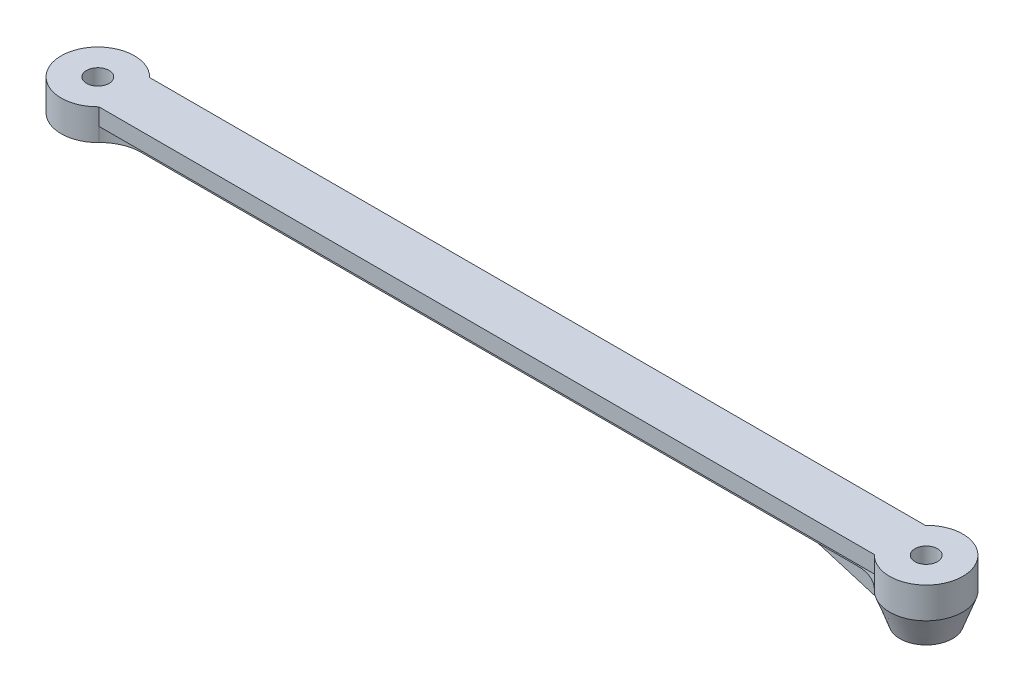
ISO-10303-21;
HEADER;
FILE_DESCRIPTION(('STEP AP214'),'2;1');
FILE_NAME('part.step','',(''),(''),'','','');
FILE_SCHEMA(('AUTOMOTIVE_DESIGN { 1 0 10303 214 1 1 1 1 }'));
ENDSEC;
DATA;
#1=APPLICATION_CONTEXT('core data for automotive mechanical design processes');
#2=APPLICATION_PROTOCOL_DEFINITION('international standard','automotive_design',2000,#1);
#3=PRODUCT_CONTEXT('',#1,'mechanical');
#4=PRODUCT('Part','Part','',(#3));
#5=PRODUCT_RELATED_PRODUCT_CATEGORY('part','',(#4));
#6=PRODUCT_DEFINITION_FORMATION('','',#4);
#7=PRODUCT_DEFINITION_CONTEXT('part definition',#1,'design');
#8=PRODUCT_DEFINITION('design','',#6,#7);
#9=PRODUCT_DEFINITION_SHAPE('','',#8);
#10=(LENGTH_UNIT() NAMED_UNIT(*) SI_UNIT(.MILLI.,.METRE.));
#11=(NAMED_UNIT(*) PLANE_ANGLE_UNIT() SI_UNIT($,.RADIAN.));
#12=(NAMED_UNIT(*) SI_UNIT($,.STERADIAN.) SOLID_ANGLE_UNIT());
#13=UNCERTAINTY_MEASURE_WITH_UNIT(LENGTH_MEASURE(1.E-05),#10,'distance_accuracy_value','');
#14=(GEOMETRIC_REPRESENTATION_CONTEXT(3) GLOBAL_UNCERTAINTY_ASSIGNED_CONTEXT((#13)) GLOBAL_UNIT_ASSIGNED_CONTEXT((#10,
#11,#12)) REPRESENTATION_CONTEXT('',''));
#15=CARTESIAN_POINT('',(0.,0.,0.));
#16=DIRECTION('',(0.,0.,1.));
#17=DIRECTION('',(1.,0.,0.));
#18=AXIS2_PLACEMENT_3D('',#15,#16,#17);
#19=CARTESIAN_POINT('',(-147.,0.,0.));
#20=DIRECTION('',(0.,1.,0.));
#21=DIRECTION('',(0.,0.,1.));
#22=AXIS2_PLACEMENT_3D('',#19,#20,#21);
#23=PLANE('',#22);
#24=CARTESIAN_POINT('',(-147.,0.,0.));
#25=DIRECTION('',(0.,1.,0.));
#26=DIRECTION('',(0.,0.,1.));
#27=AXIS2_PLACEMENT_3D('',#24,#25,#26);
#28=CIRCLE('',#27,2.);
#29=CARTESIAN_POINT('',(-147.,0.,2.));
#30=VERTEX_POINT('',#29);
#31=EDGE_CURVE('E262',#30,#30,#28,.T.);
#32=ORIENTED_EDGE('',*,*,#31,.T.);
#33=EDGE_LOOP('',(#32));
#34=FACE_BOUND('',#33,.T.);
#35=DIRECTION('',(-1.,0.,0.));
#36=VECTOR('',#35,1.);
#37=CARTESIAN_POINT('',(-3.08000003216462,0.,1.25));
#38=LINE('',#37,#36);
#39=CARTESIAN_POINT('',(-6.37929922012127,0.,1.25000003393926));
#40=VERTEX_POINT('',#39);
#41=CARTESIAN_POINT('',(-21.2800000321646,0.,1.25));
#42=VERTEX_POINT('',#41);
#43=EDGE_CURVE('E153',#40,#42,#38,.T.);
#44=ORIENTED_EDGE('',*,*,#43,.F.);
#45=CARTESIAN_POINT('',(0.,0.,0.));
#46=DIRECTION('',(0.,-1.,0.));
#47=DIRECTION('',(0.,0.,-1.));
#48=AXIS2_PLACEMENT_3D('',#45,#46,#47);
#49=CIRCLE('',#48,6.50000000000002);
#50=CARTESIAN_POINT('',(-4.69109029053925,0.,4.4992945804657));
#51=VERTEX_POINT('',#50);
#52=EDGE_CURVE('E231',#51,#40,#49,.T.);
#53=ORIENTED_EDGE('',*,*,#52,.F.);
#54=CARTESIAN_POINT('',(-9.96713348962479,0.,9.56249999999999));
#55=DIRECTION('',(0.,-1.,0.));
#56=DIRECTION('',(0.,0.,1.));
#57=AXIS2_PLACEMENT_3D('',#54,#55,#56);
#58=CIRCLE('',#57,7.3125);
#59=CARTESIAN_POINT('',(-9.9671334896248,0.,2.24999999999998));
#60=VERTEX_POINT('',#59);
#61=EDGE_CURVE('E257',#60,#51,#58,.T.);
#62=ORIENTED_EDGE('',*,*,#61,.F.);
#63=DIRECTION('',(1.,0.,0.));
#64=VECTOR('',#63,1.);
#65=CARTESIAN_POINT('',(-9.9671334896248,0.,2.24999999999998));
#66=LINE('',#65,#64);
#67=CARTESIAN_POINT('',(-137.032866510375,0.,2.24999999999999));
#68=VERTEX_POINT('',#67);
#69=EDGE_CURVE('E244',#68,#60,#66,.T.);
#70=ORIENTED_EDGE('',*,*,#69,.F.);
#71=CARTESIAN_POINT('',(-137.032866510375,0.,9.56250000000001));
#72=DIRECTION('',(0.,-1.,0.));
#73=DIRECTION('',(0.,0.,-1.));
#74=AXIS2_PLACEMENT_3D('',#71,#72,#73);
#75=CIRCLE('',#74,7.31250000000002);
#76=CARTESIAN_POINT('',(-142.309584240177,0.,4.49999999999997));
#77=VERTEX_POINT('',#76);
#78=EDGE_CURVE('E254',#77,#68,#75,.T.);
#79=ORIENTED_EDGE('',*,*,#78,.F.);
#80=CARTESIAN_POINT('',(-147.,0.,0.));
#81=DIRECTION('',(0.,1.,0.));
#82=DIRECTION('',(0.,0.,1.));
#83=AXIS2_PLACEMENT_3D('',#80,#81,#82);
#84=CIRCLE('',#83,6.5);
#85=CARTESIAN_POINT('',(-142.309584240177,0.,-4.5));
#86=VERTEX_POINT('',#85);
#87=EDGE_CURVE('E300',#86,#77,#84,.T.);
#88=ORIENTED_EDGE('',*,*,#87,.F.);
#89=CARTESIAN_POINT('',(-137.032866510375,0.,-9.56250000000001));
#90=DIRECTION('',(0.,-1.,0.));
#91=DIRECTION('',(0.,0.,1.));
#92=AXIS2_PLACEMENT_3D('',#89,#90,#91);
#93=CIRCLE('',#92,7.31249999999999);
#94=CARTESIAN_POINT('',(-137.032866510375,0.,-2.25000000000001));
#95=VERTEX_POINT('',#94);
#96=EDGE_CURVE('E271',#95,#86,#93,.T.);
#97=ORIENTED_EDGE('',*,*,#96,.F.);
#98=DIRECTION('',(-1.,0.,0.));
#99=VECTOR('',#98,1.);
#100=CARTESIAN_POINT('',(-9.96713348962481,0.,-2.25));
#101=LINE('',#100,#99);
#102=CARTESIAN_POINT('',(-9.96713348962481,0.,-2.25));
#103=VERTEX_POINT('',#102);
#104=EDGE_CURVE('E280',#103,#95,#101,.T.);
#105=ORIENTED_EDGE('',*,*,#104,.F.);
#106=CARTESIAN_POINT('',(-9.96713348962481,0.,-9.56250000000001));
#107=DIRECTION('',(0.,-1.,0.));
#108=DIRECTION('',(0.,0.,-1.));
#109=AXIS2_PLACEMENT_3D('',#106,#107,#108);
#110=CIRCLE('',#109,7.3125);
#111=CARTESIAN_POINT('',(-4.69043967413093,0.,-4.50002301416721));
#112=VERTEX_POINT('',#111);
#113=EDGE_CURVE('E283',#112,#103,#110,.T.);
#114=ORIENTED_EDGE('',*,*,#113,.F.);
#115=CARTESIAN_POINT('',(-6.37929766491856,0.,-1.24999989519081));
#116=VERTEX_POINT('',#115);
#117=EDGE_CURVE('E441',#116,#112,#49,.T.);
#118=ORIENTED_EDGE('',*,*,#117,.F.);
#119=DIRECTION('',(-1.,0.,0.));
#120=VECTOR('',#119,1.);
#121=CARTESIAN_POINT('',(-3.08000003216462,0.,-1.25));
#122=LINE('',#121,#120);
#123=CARTESIAN_POINT('',(-21.2800000321646,0.,-1.25));
#124=VERTEX_POINT('',#123);
#125=EDGE_CURVE('E60',#116,#124,#122,.T.);
#126=ORIENTED_EDGE('',*,*,#125,.T.);
#127=DIRECTION('',(0.,0.,-1.));
#128=VECTOR('',#127,1.);
#129=CARTESIAN_POINT('',(-21.2800000321646,0.,1.25));
#130=LINE('',#129,#128);
#131=EDGE_CURVE('E55',#42,#124,#130,.T.);
#132=ORIENTED_EDGE('',*,*,#131,.F.);
#133=EDGE_LOOP('',(#44,#53,#62,#70,#79,#88,#97,#105,#114,#118,#126,#132));
#134=FACE_BOUND('',#133,.T.);
#135=ADVANCED_FACE('F37',(#34,#134),#23,.F.);
#136=CARTESIAN_POINT('',(0.,-5.,0.));
#137=DIRECTION('',(0.,1.,0.));
#138=DIRECTION('',(0.,0.,1.));
#139=AXIS2_PLACEMENT_3D('',#136,#137,#138);
#140=CONICAL_SURFACE('',#139,4.68,0.349092133951805);
#141=ORIENTED_EDGE('',*,*,#52,.T.);
#142=CARTESIAN_POINT('',(-8.61696060219028,6.0636066150433,1.25));
#143=CARTESIAN_POINT('',(-8.43030599871527,5.55613704654127,1.25));
#144=CARTESIAN_POINT('',(-8.24354541919595,5.04870642478064,1.25));
#145=CARTESIAN_POINT('',(-7.86975365586061,4.03394459450432,1.25));
#146=CARTESIAN_POINT('',(-7.68272247191741,3.52661338603547,1.25));
#147=CARTESIAN_POINT('',(-7.12113302336583,2.00479571089433,1.25));
#148=CARTESIAN_POINT('',(-6.74608112908715,0.990491362462012,1.25));
#149=CARTESIAN_POINT('',(-5.99394719096289,-1.03719120662551,1.25));
#150=CARTESIAN_POINT('',(-5.61686546302824,-2.050569544232,1.25));
#151=CARTESIAN_POINT('',(-5.0484047572454,-3.56957808219935,1.25));
#152=CARTESIAN_POINT('',(-4.85844439697906,-4.07573892758262,1.25));
#153=CARTESIAN_POINT('',(-4.47717352196537,-5.08755181557813,1.25));
#154=CARTESIAN_POINT('',(-4.28586300894899,-5.59320385884175,1.25));
#155=CARTESIAN_POINT('',(-3.93533000225117,-6.51421680365429,1.25));
#156=CARTESIAN_POINT('',(-3.77642864896639,-6.92969985763672,1.25));
#157=CARTESIAN_POINT('',(-3.45669672968412,-7.75991555138109,1.25));
#158=CARTESIAN_POINT('',(-3.2958662024499,-8.1746482060289,1.25));
#159=CARTESIAN_POINT('',(-3.05239823007103,-8.79589610952701,1.25));
#160=CARTESIAN_POINT('',(-2.97086853759102,-9.00284523967557,1.25));
#161=CARTESIAN_POINT('',(-2.8068604047672,-9.41636576774358,1.25));
#162=CARTESIAN_POINT('',(-2.7243819711586,-9.62293716833253,1.25));
#163=CARTESIAN_POINT('',(-2.55820566485512,-10.0356052539102,1.25));
#164=CARTESIAN_POINT('',(-2.47450771668625,-10.2417019085957,1.25));
#165=CARTESIAN_POINT('',(-2.30544369253139,-10.6532150643155,1.25));
#166=CARTESIAN_POINT('',(-2.22007757573289,-10.8586315485651,1.25));
#167=CARTESIAN_POINT('',(-2.13365255737588,-11.0636066150433,1.25));
#168=B_SPLINE_CURVE_WITH_KNOTS('',3,(#142,#143,#144,#145,#146,#147,#148,#149,#150,#151,#152,
#153,#154,#155,#156,#157,#158,#159,#160,#161,#162,#163,#164,#165,#166,#167),.UNSPECIFIED.,.F.,
.F.,(4,2,2,2,2,2,2,2,2,2,2,2,4),(0.,1.6221244837254,3.24424973004629,6.48851993690394,
9.73229903789424,11.3541960353339,12.9760909537954,14.3105852786917,15.6450528340919,
16.3123405211941,16.9796234740758,17.6469479010328,18.314288674883),.UNSPECIFIED.);
#169=CARTESIAN_POINT('',(-4.50998168744277,-5.,1.24999907255157));
#170=VERTEX_POINT('',#169);
#171=EDGE_CURVE('E178',#40,#170,#168,.T.);
#172=ORIENTED_EDGE('',*,*,#171,.T.);
#173=CARTESIAN_POINT('',(0.,-5.,0.));
#174=DIRECTION('',(0.,-1.,0.));
#175=DIRECTION('',(0.,0.,-1.));
#176=AXIS2_PLACEMENT_3D('',#173,#174,#175);
#177=CIRCLE('',#176,4.68);
#178=CARTESIAN_POINT('',(-4.509974455259,-5.,-1.25));
#179=VERTEX_POINT('',#178);
#180=EDGE_CURVE('E169',#179,#170,#177,.T.);
#181=ORIENTED_EDGE('',*,*,#180,.F.);
#182=CARTESIAN_POINT('',(-8.61696060219028,6.06360661504331,-1.25));
#183=CARTESIAN_POINT('',(-8.43030599871527,5.55613704654127,-1.25));
#184=CARTESIAN_POINT('',(-8.24354541919595,5.04870642478064,-1.25));
#185=CARTESIAN_POINT('',(-7.86975365586061,4.03394459450432,-1.25));
#186=CARTESIAN_POINT('',(-7.68272247191741,3.52661338603547,-1.25));
#187=CARTESIAN_POINT('',(-7.12113302336583,2.00479571089433,-1.25));
#188=CARTESIAN_POINT('',(-6.74608112908715,0.990491362462013,-1.25));
#189=CARTESIAN_POINT('',(-5.99394719096289,-1.03719120662551,-1.25));
#190=CARTESIAN_POINT('',(-5.61686546302824,-2.050569544232,-1.25));
#191=CARTESIAN_POINT('',(-5.04840475724539,-3.56957808219935,-1.25));
#192=CARTESIAN_POINT('',(-4.85844439697906,-4.07573892758262,-1.25));
#193=CARTESIAN_POINT('',(-4.47717352196537,-5.08755181557814,-1.25));
#194=CARTESIAN_POINT('',(-4.28586300894899,-5.59320385884175,-1.25));
#195=CARTESIAN_POINT('',(-3.93533000225117,-6.51421680365429,-1.25));
#196=CARTESIAN_POINT('',(-3.77642864896639,-6.92969985763672,-1.25));
#197=CARTESIAN_POINT('',(-3.45669672968412,-7.75991555138109,-1.25));
#198=CARTESIAN_POINT('',(-3.2958662024499,-8.17464820602891,-1.25));
#199=CARTESIAN_POINT('',(-3.05239823007103,-8.79589610952701,-1.25));
#200=CARTESIAN_POINT('',(-2.97086853759101,-9.00284523967557,-1.25));
#201=CARTESIAN_POINT('',(-2.8068604047672,-9.41636576774359,-1.25));
#202=CARTESIAN_POINT('',(-2.7243819711586,-9.62293716833254,-1.25));
#203=CARTESIAN_POINT('',(-2.55820566485511,-10.0356052539102,-1.25));
#204=CARTESIAN_POINT('',(-2.47450771668625,-10.2417019085957,-1.25));
#205=CARTESIAN_POINT('',(-2.30544369253139,-10.6532150643155,-1.25));
#206=CARTESIAN_POINT('',(-2.22007757573289,-10.8586315485651,-1.25));
#207=CARTESIAN_POINT('',(-2.13365255737588,-11.0636066150433,-1.25));
#208=B_SPLINE_CURVE_WITH_KNOTS('',3,(#182,#183,#184,#185,#186,#187,#188,#189,#190,#191,#192,
#193,#194,#195,#196,#197,#198,#199,#200,#201,#202,#203,#204,#205,#206,#207),.UNSPECIFIED.,.F.,
.F.,(4,2,2,2,2,2,2,2,2,2,2,2,4),(0.,1.6221244837254,3.24424973004629,6.48851993690394,
9.73229903789424,11.3541960353339,12.9760909537954,14.3105852786917,15.645052834092,
16.3123405211941,16.9796234740758,17.6469479010328,18.314288674883),.UNSPECIFIED.);
#209=EDGE_CURVE('E192',#116,#179,#208,.T.);
#210=ORIENTED_EDGE('',*,*,#209,.F.);
#211=ORIENTED_EDGE('',*,*,#117,.T.);
#212=CARTESIAN_POINT('',(0.,0.,0.));
#213=DIRECTION('',(0.,-1.,0.));
#214=DIRECTION('',(0.,0.,-1.));
#215=AXIS2_PLACEMENT_3D('',#212,#213,#214);
#216=CIRCLE('',#215,6.50000000000001);
#217=EDGE_CURVE('E305',#51,#112,#216,.F.);
#218=ORIENTED_EDGE('',*,*,#217,.F.);
#219=EDGE_LOOP('',(#141,#172,#181,#210,#211,#218));
#220=FACE_BOUND('',#219,.T.);
#221=ADVANCED_FACE('F204',(#220),#140,.T.);
#222=CARTESIAN_POINT('',(-142.309584240177,5.5,-4.5));
#223=DIRECTION('',(0.,0.,1.));
#224=DIRECTION('',(1.,0.,0.));
#225=AXIS2_PLACEMENT_3D('',#222,#223,#224);
#226=PLANE('',#225);
#227=DIRECTION('',(1.,0.,0.));
#228=VECTOR('',#227,1.);
#229=CARTESIAN_POINT('',(-142.309584240177,2.5,-4.5));
#230=LINE('',#229,#228);
#231=CARTESIAN_POINT('',(-142.309584240177,2.5,-4.5));
#232=VERTEX_POINT('',#231);
#233=CARTESIAN_POINT('',(-4.69041575982347,2.5,-4.5));
#234=VERTEX_POINT('',#233);
#235=EDGE_CURVE('E276',#232,#234,#230,.T.);
#236=ORIENTED_EDGE('',*,*,#235,.F.);
#237=DIRECTION('',(0.,-1.,0.));
#238=VECTOR('',#237,1.);
#239=CARTESIAN_POINT('',(-142.309584240177,5.5,-4.5));
#240=LINE('',#239,#238);
#241=CARTESIAN_POINT('',(-142.309584240177,5.5,-4.5));
#242=VERTEX_POINT('',#241);
#243=EDGE_CURVE('E311',#242,#232,#240,.T.);
#244=ORIENTED_EDGE('',*,*,#243,.F.);
#245=DIRECTION('',(-1.,0.,0.));
#246=VECTOR('',#245,1.);
#247=CARTESIAN_POINT('',(-142.309584240177,5.5,-4.5));
#248=LINE('',#247,#246);
#249=CARTESIAN_POINT('',(-4.69041575982347,5.5,-4.5));
#250=VERTEX_POINT('',#249);
#251=EDGE_CURVE('E309',#250,#242,#248,.T.);
#252=ORIENTED_EDGE('',*,*,#251,.F.);
#253=DIRECTION('',(0.,-1.,0.));
#254=VECTOR('',#253,1.);
#255=CARTESIAN_POINT('',(-4.69041575982347,5.5,-4.5));
#256=LINE('',#255,#254);
#257=EDGE_CURVE('E316',#250,#234,#256,.T.);
#258=ORIENTED_EDGE('',*,*,#257,.T.);
#259=EDGE_LOOP('',(#236,#244,#252,#258));
#260=FACE_BOUND('',#259,.T.);
#261=ADVANCED_FACE('F359',(#260),#226,.F.);
#262=CARTESIAN_POINT('',(-147.,5.5,0.));
#263=DIRECTION('',(0.,1.,0.));
#264=DIRECTION('',(0.,0.,1.));
#265=AXIS2_PLACEMENT_3D('',#262,#263,#264);
#266=PLANE('',#265);
#267=CARTESIAN_POINT('',(0.,5.5,0.));
#268=DIRECTION('',(0.,1.,0.));
#269=DIRECTION('',(0.,0.,1.));
#270=AXIS2_PLACEMENT_3D('',#267,#268,#269);
#271=CIRCLE('',#270,2.);
#272=CARTESIAN_POINT('',(0.,5.5,2.));
#273=VERTEX_POINT('',#272);
#274=EDGE_CURVE('E295',#273,#273,#271,.T.);
#275=ORIENTED_EDGE('',*,*,#274,.F.);
#276=EDGE_LOOP('',(#275));
#277=FACE_BOUND('',#276,.T.);
#278=CARTESIAN_POINT('',(-147.,5.5,0.));
#279=DIRECTION('',(0.,1.,0.));
#280=DIRECTION('',(0.,0.,1.));
#281=AXIS2_PLACEMENT_3D('',#278,#279,#280);
#282=CIRCLE('',#281,6.5);
#283=CARTESIAN_POINT('',(-142.309584240177,5.5,4.5));
#284=VERTEX_POINT('',#283);
#285=EDGE_CURVE('E301',#242,#284,#282,.T.);
#286=ORIENTED_EDGE('',*,*,#285,.T.);
#287=DIRECTION('',(1.,0.,0.));
#288=VECTOR('',#287,1.);
#289=CARTESIAN_POINT('',(-142.309584240177,5.5,4.5));
#290=LINE('',#289,#288);
#291=CARTESIAN_POINT('',(-4.69041575982348,5.5,4.49999999999997));
#292=VERTEX_POINT('',#291);
#293=EDGE_CURVE('E304',#284,#292,#290,.T.);
#294=ORIENTED_EDGE('',*,*,#293,.T.);
#295=CARTESIAN_POINT('',(0.,5.5,0.));
#296=DIRECTION('',(0.,1.,0.));
#297=DIRECTION('',(0.,0.,1.));
#298=AXIS2_PLACEMENT_3D('',#295,#296,#297);
#299=CIRCLE('',#298,6.50000000000001);
#300=EDGE_CURVE('E307',#292,#250,#299,.T.);
#301=ORIENTED_EDGE('',*,*,#300,.T.);
#302=ORIENTED_EDGE('',*,*,#251,.T.);
#303=EDGE_LOOP('',(#286,#294,#301,#302));
#304=FACE_BOUND('',#303,.T.);
#305=CARTESIAN_POINT('',(-147.,5.5,0.));
#306=DIRECTION('',(0.,1.,0.));
#307=DIRECTION('',(0.,0.,1.));
#308=AXIS2_PLACEMENT_3D('',#305,#306,#307);
#309=CIRCLE('',#308,2.);
#310=CARTESIAN_POINT('',(-147.,5.5,2.));
#311=VERTEX_POINT('',#310);
#312=EDGE_CURVE('E292',#311,#311,#309,.T.);
#313=ORIENTED_EDGE('',*,*,#312,.F.);
#314=EDGE_LOOP('',(#313));
#315=FACE_BOUND('',#314,.T.);
#316=ADVANCED_FACE('F357',(#277,#304,#315),#266,.T.);
#317=CARTESIAN_POINT('',(-147.,5.5,0.));
#318=DIRECTION('',(0.,-1.,0.));
#319=DIRECTION('',(0.,0.,-1.));
#320=AXIS2_PLACEMENT_3D('',#317,#318,#319);
#321=CYLINDRICAL_SURFACE('',#320,6.5);
#322=ORIENTED_EDGE('',*,*,#87,.T.);
#323=DIRECTION('',(0.,-1.,0.));
#324=VECTOR('',#323,1.);
#325=CARTESIAN_POINT('',(-142.309584240177,2.5,4.49999999999997));
#326=LINE('',#325,#324);
#327=CARTESIAN_POINT('',(-142.309584240177,2.5,4.49999999999997));
#328=VERTEX_POINT('',#327);
#329=EDGE_CURVE('E265',#328,#77,#326,.T.);
#330=ORIENTED_EDGE('',*,*,#329,.F.);
#331=DIRECTION('',(0.,-1.,0.));
#332=VECTOR('',#331,1.);
#333=CARTESIAN_POINT('',(-142.309584240177,5.5,4.5));
#334=LINE('',#333,#332);
#335=EDGE_CURVE('E12',#284,#328,#334,.T.);
#336=ORIENTED_EDGE('',*,*,#335,.F.);
#337=ORIENTED_EDGE('',*,*,#285,.F.);
#338=ORIENTED_EDGE('',*,*,#243,.T.);
#339=DIRECTION('',(0.,-1.,0.));
#340=VECTOR('',#339,1.);
#341=CARTESIAN_POINT('',(-142.309584240177,2.5,-4.5));
#342=LINE('',#341,#340);
#343=EDGE_CURVE('E285',#232,#86,#342,.T.);
#344=ORIENTED_EDGE('',*,*,#343,.T.);
#345=EDGE_LOOP('',(#322,#330,#336,#337,#338,#344));
#346=FACE_BOUND('',#345,.T.);
#347=ADVANCED_FACE('F39',(#346),#321,.T.);
#348=CARTESIAN_POINT('',(-142.309584240177,5.5,4.5));
#349=DIRECTION('',(0.,0.,-1.));
#350=DIRECTION('',(-1.,0.,0.));
#351=AXIS2_PLACEMENT_3D('',#348,#349,#350);
#352=PLANE('',#351);
#353=ORIENTED_EDGE('',*,*,#335,.T.);
#354=DIRECTION('',(-1.,0.,0.));
#355=VECTOR('',#354,1.);
#356=CARTESIAN_POINT('',(-4.69041575982348,2.5,4.49999999999997));
#357=LINE('',#356,#355);
#358=CARTESIAN_POINT('',(-4.69041575982348,2.5,4.49999999999997));
#359=VERTEX_POINT('',#358);
#360=EDGE_CURVE('E243',#359,#328,#357,.T.);
#361=ORIENTED_EDGE('',*,*,#360,.F.);
#362=DIRECTION('',(0.,-1.,0.));
#363=VECTOR('',#362,1.);
#364=CARTESIAN_POINT('',(-4.69041575982348,5.5,4.49999999999997));
#365=LINE('',#364,#363);
#366=EDGE_CURVE('E47',#292,#359,#365,.T.);
#367=ORIENTED_EDGE('',*,*,#366,.F.);
#368=ORIENTED_EDGE('',*,*,#293,.F.);
#369=EDGE_LOOP('',(#353,#361,#367,#368));
#370=FACE_BOUND('',#369,.T.);
#371=ADVANCED_FACE('F366',(#370),#352,.F.);
#372=CARTESIAN_POINT('',(0.,5.5,0.));
#373=DIRECTION('',(0.,-1.,0.));
#374=DIRECTION('',(0.,0.,-1.));
#375=AXIS2_PLACEMENT_3D('',#372,#373,#374);
#376=CYLINDRICAL_SURFACE('',#375,6.50000000000001);
#377=ORIENTED_EDGE('',*,*,#217,.T.);
#378=DIRECTION('',(0.,-1.,0.));
#379=VECTOR('',#378,1.);
#380=CARTESIAN_POINT('',(-4.69041575982347,2.5,-4.5));
#381=LINE('',#380,#379);
#382=EDGE_CURVE('E288',#234,#112,#381,.T.);
#383=ORIENTED_EDGE('',*,*,#382,.F.);
#384=ORIENTED_EDGE('',*,*,#257,.F.);
#385=ORIENTED_EDGE('',*,*,#300,.F.);
#386=ORIENTED_EDGE('',*,*,#366,.T.);
#387=DIRECTION('',(0.,-1.,0.));
#388=VECTOR('',#387,1.);
#389=CARTESIAN_POINT('',(-4.69041575982348,2.5,4.49999999999997));
#390=LINE('',#389,#388);
#391=EDGE_CURVE('E253',#359,#51,#390,.T.);
#392=ORIENTED_EDGE('',*,*,#391,.T.);
#393=EDGE_LOOP('',(#377,#383,#384,#385,#386,#392));
#394=FACE_BOUND('',#393,.T.);
#395=ADVANCED_FACE('F363',(#394),#376,.T.);
#396=CARTESIAN_POINT('',(0.,5.5,0.));
#397=DIRECTION('',(0.,-1.,0.));
#398=DIRECTION('',(0.,0.,-1.));
#399=AXIS2_PLACEMENT_3D('',#396,#397,#398);
#400=CYLINDRICAL_SURFACE('',#399,2.);
#401=ORIENTED_EDGE('',*,*,#274,.T.);
#402=EDGE_LOOP('',(#401));
#403=FACE_BOUND('',#402,.T.);
#404=CARTESIAN_POINT('',(0.,-5.,0.));
#405=DIRECTION('',(0.,-1.,0.));
#406=DIRECTION('',(0.,0.,-1.));
#407=AXIS2_PLACEMENT_3D('',#404,#405,#406);
#408=CIRCLE('',#407,2.);
#409=CARTESIAN_POINT('',(0.,-5.,-2.));
#410=VERTEX_POINT('',#409);
#411=EDGE_CURVE('E440',#410,#410,#408,.T.);
#412=ORIENTED_EDGE('',*,*,#411,.T.);
#413=EDGE_LOOP('',(#412));
#414=FACE_BOUND('',#413,.T.);
#415=ADVANCED_FACE('F365',(#403,#414),#400,.F.);
#416=CARTESIAN_POINT('',(-147.,5.5,0.));
#417=DIRECTION('',(0.,-1.,0.));
#418=DIRECTION('',(0.,0.,-1.));
#419=AXIS2_PLACEMENT_3D('',#416,#417,#418);
#420=CYLINDRICAL_SURFACE('',#419,2.);
#421=ORIENTED_EDGE('',*,*,#312,.T.);
#422=EDGE_LOOP('',(#421));
#423=FACE_BOUND('',#422,.T.);
#424=ORIENTED_EDGE('',*,*,#31,.F.);
#425=EDGE_LOOP('',(#424));
#426=FACE_BOUND('',#425,.T.);
#427=ADVANCED_FACE('F429',(#423,#426),#420,.F.);
#428=CARTESIAN_POINT('',(-9.96713348962481,2.5,-9.56250000000001));
#429=DIRECTION('',(0.,-1.,0.));
#430=DIRECTION('',(0.,0.,-1.));
#431=AXIS2_PLACEMENT_3D('',#428,#429,#430);
#432=CYLINDRICAL_SURFACE('',#431,7.3125);
#433=ORIENTED_EDGE('',*,*,#113,.T.);
#434=DIRECTION('',(0.,-1.,0.));
#435=VECTOR('',#434,1.);
#436=CARTESIAN_POINT('',(-9.96713348962481,2.5,-2.25));
#437=LINE('',#436,#435);
#438=CARTESIAN_POINT('',(-9.96713348962481,2.5,-2.25));
#439=VERTEX_POINT('',#438);
#440=EDGE_CURVE('E279',#439,#103,#437,.T.);
#441=ORIENTED_EDGE('',*,*,#440,.F.);
#442=CARTESIAN_POINT('',(-9.96713348962481,2.5,-9.56250000000001));
#443=DIRECTION('',(0.,-1.,0.));
#444=DIRECTION('',(0.,0.,-1.));
#445=AXIS2_PLACEMENT_3D('',#442,#443,#444);
#446=CIRCLE('',#445,7.3125);
#447=EDGE_CURVE('E267',#234,#439,#446,.T.);
#448=ORIENTED_EDGE('',*,*,#447,.F.);
#449=ORIENTED_EDGE('',*,*,#382,.T.);
#450=EDGE_LOOP('',(#433,#441,#448,#449));
#451=FACE_BOUND('',#450,.T.);
#452=ADVANCED_FACE('F412',(#451),#432,.F.);
#453=CARTESIAN_POINT('',(-137.032866510375,2.5,-9.56250000000001));
#454=DIRECTION('',(0.,-1.,0.));
#455=DIRECTION('',(0.,0.,-1.));
#456=AXIS2_PLACEMENT_3D('',#453,#454,#455);
#457=CYLINDRICAL_SURFACE('',#456,7.31249999999999);
#458=ORIENTED_EDGE('',*,*,#96,.T.);
#459=ORIENTED_EDGE('',*,*,#343,.F.);
#460=CARTESIAN_POINT('',(-137.032866510375,2.5,-9.56250000000001));
#461=DIRECTION('',(0.,-1.,0.));
#462=DIRECTION('',(0.,0.,1.));
#463=AXIS2_PLACEMENT_3D('',#460,#461,#462);
#464=CIRCLE('',#463,7.31249999999999);
#465=CARTESIAN_POINT('',(-137.032866510375,2.5,-2.25000000000001));
#466=VERTEX_POINT('',#465);
#467=EDGE_CURVE('E274',#466,#232,#464,.T.);
#468=ORIENTED_EDGE('',*,*,#467,.F.);
#469=DIRECTION('',(0.,-1.,0.));
#470=VECTOR('',#469,1.);
#471=CARTESIAN_POINT('',(-137.032866510375,2.5,-2.25000000000001));
#472=LINE('',#471,#470);
#473=EDGE_CURVE('E289',#466,#95,#472,.T.);
#474=ORIENTED_EDGE('',*,*,#473,.T.);
#475=EDGE_LOOP('',(#458,#459,#468,#474));
#476=FACE_BOUND('',#475,.T.);
#477=ADVANCED_FACE('F405',(#476),#457,.F.);
#478=CARTESIAN_POINT('',(-9.96713348962481,2.5,-2.25));
#479=DIRECTION('',(0.,0.,1.));
#480=DIRECTION('',(1.,0.,0.));
#481=AXIS2_PLACEMENT_3D('',#478,#479,#480);
#482=PLANE('',#481);
#483=ORIENTED_EDGE('',*,*,#104,.T.);
#484=ORIENTED_EDGE('',*,*,#473,.F.);
#485=DIRECTION('',(-1.,0.,0.));
#486=VECTOR('',#485,1.);
#487=CARTESIAN_POINT('',(-9.96713348962481,2.5,-2.25));
#488=LINE('',#487,#486);
#489=EDGE_CURVE('E270',#439,#466,#488,.T.);
#490=ORIENTED_EDGE('',*,*,#489,.F.);
#491=ORIENTED_EDGE('',*,*,#440,.T.);
#492=EDGE_LOOP('',(#483,#484,#490,#491));
#493=FACE_BOUND('',#492,.T.);
#494=ADVANCED_FACE('F409',(#493),#482,.F.);
#495=CARTESIAN_POINT('',(-9.96713348962481,2.5,-9.56250000000001));
#496=DIRECTION('',(0.,-1.,0.));
#497=DIRECTION('',(0.,0.,-1.));
#498=AXIS2_PLACEMENT_3D('',#495,#496,#497);
#499=PLANE('',#498);
#500=ORIENTED_EDGE('',*,*,#447,.T.);
#501=ORIENTED_EDGE('',*,*,#489,.T.);
#502=ORIENTED_EDGE('',*,*,#467,.T.);
#503=ORIENTED_EDGE('',*,*,#235,.T.);
#504=EDGE_LOOP('',(#500,#501,#502,#503));
#505=FACE_BOUND('',#504,.T.);
#506=ADVANCED_FACE('F414',(#505),#499,.T.);
#507=CARTESIAN_POINT('',(-9.96713348962479,2.5,9.56249999999999));
#508=DIRECTION('',(0.,-1.,0.));
#509=DIRECTION('',(0.,0.,-1.));
#510=AXIS2_PLACEMENT_3D('',#507,#508,#509);
#511=CYLINDRICAL_SURFACE('',#510,7.3125);
#512=ORIENTED_EDGE('',*,*,#61,.T.);
#513=ORIENTED_EDGE('',*,*,#391,.F.);
#514=CARTESIAN_POINT('',(-9.96713348962479,2.5,9.56249999999999));
#515=DIRECTION('',(0.,-1.,0.));
#516=DIRECTION('',(0.,0.,1.));
#517=AXIS2_PLACEMENT_3D('',#514,#515,#516);
#518=CIRCLE('',#517,7.3125);
#519=CARTESIAN_POINT('',(-9.9671334896248,2.5,2.24999999999998));
#520=VERTEX_POINT('',#519);
#521=EDGE_CURVE('E239',#520,#359,#518,.T.);
#522=ORIENTED_EDGE('',*,*,#521,.F.);
#523=DIRECTION('',(0.,-1.,0.));
#524=VECTOR('',#523,1.);
#525=CARTESIAN_POINT('',(-9.9671334896248,2.5,2.24999999999998));
#526=LINE('',#525,#524);
#527=EDGE_CURVE('E260',#520,#60,#526,.T.);
#528=ORIENTED_EDGE('',*,*,#527,.T.);
#529=EDGE_LOOP('',(#512,#513,#522,#528));
#530=FACE_BOUND('',#529,.T.);
#531=ADVANCED_FACE('F392',(#530),#511,.F.);
#532=CARTESIAN_POINT('',(-9.9671334896248,2.5,2.24999999999998));
#533=DIRECTION('',(0.,0.,-1.));
#534=DIRECTION('',(-1.,0.,0.));
#535=AXIS2_PLACEMENT_3D('',#532,#533,#534);
#536=PLANE('',#535);
#537=ORIENTED_EDGE('',*,*,#69,.T.);
#538=ORIENTED_EDGE('',*,*,#527,.F.);
#539=DIRECTION('',(1.,0.,0.));
#540=VECTOR('',#539,1.);
#541=CARTESIAN_POINT('',(-9.9671334896248,2.5,2.24999999999998));
#542=LINE('',#541,#540);
#543=CARTESIAN_POINT('',(-137.032866510375,2.5,2.24999999999999));
#544=VERTEX_POINT('',#543);
#545=EDGE_CURVE('E250',#544,#520,#542,.T.);
#546=ORIENTED_EDGE('',*,*,#545,.F.);
#547=DIRECTION('',(0.,-1.,0.));
#548=VECTOR('',#547,1.);
#549=CARTESIAN_POINT('',(-137.032866510375,2.5,2.24999999999999));
#550=LINE('',#549,#548);
#551=EDGE_CURVE('E263',#544,#68,#550,.T.);
#552=ORIENTED_EDGE('',*,*,#551,.T.);
#553=EDGE_LOOP('',(#537,#538,#546,#552));
#554=FACE_BOUND('',#553,.T.);
#555=ADVANCED_FACE('F386',(#554),#536,.F.);
#556=CARTESIAN_POINT('',(-137.032866510375,2.5,9.56250000000001));
#557=DIRECTION('',(0.,-1.,0.));
#558=DIRECTION('',(0.,0.,-1.));
#559=AXIS2_PLACEMENT_3D('',#556,#557,#558);
#560=CYLINDRICAL_SURFACE('',#559,7.31250000000002);
#561=ORIENTED_EDGE('',*,*,#78,.T.);
#562=ORIENTED_EDGE('',*,*,#551,.F.);
#563=CARTESIAN_POINT('',(-137.032866510375,2.5,9.56250000000001));
#564=DIRECTION('',(0.,-1.,0.));
#565=DIRECTION('',(0.,0.,-1.));
#566=AXIS2_PLACEMENT_3D('',#563,#564,#565);
#567=CIRCLE('',#566,7.31250000000002);
#568=EDGE_CURVE('E247',#328,#544,#567,.T.);
#569=ORIENTED_EDGE('',*,*,#568,.F.);
#570=ORIENTED_EDGE('',*,*,#329,.T.);
#571=EDGE_LOOP('',(#561,#562,#569,#570));
#572=FACE_BOUND('',#571,.T.);
#573=ADVANCED_FACE('F382',(#572),#560,.F.);
#574=CARTESIAN_POINT('',(-9.96713348962479,2.5,9.56249999999999));
#575=DIRECTION('',(0.,1.,0.));
#576=DIRECTION('',(0.,0.,1.));
#577=AXIS2_PLACEMENT_3D('',#574,#575,#576);
#578=PLANE('',#577);
#579=ORIENTED_EDGE('',*,*,#521,.T.);
#580=ORIENTED_EDGE('',*,*,#360,.T.);
#581=ORIENTED_EDGE('',*,*,#568,.T.);
#582=ORIENTED_EDGE('',*,*,#545,.T.);
#583=EDGE_LOOP('',(#579,#580,#581,#582));
#584=FACE_BOUND('',#583,.T.);
#585=ADVANCED_FACE('F390',(#584),#578,.F.);
#586=CARTESIAN_POINT('',(0.,-5.,0.));
#587=DIRECTION('',(0.,-1.,0.));
#588=DIRECTION('',(0.,0.,-1.));
#589=AXIS2_PLACEMENT_3D('',#586,#587,#588);
#590=PLANE('',#589);
#591=ORIENTED_EDGE('',*,*,#180,.T.);
#592=DIRECTION('',(1.,0.,0.));
#593=VECTOR('',#592,1.);
#594=CARTESIAN_POINT('',(-4.68000003216462,-5.,1.25));
#595=LINE('',#594,#593);
#596=CARTESIAN_POINT('',(-4.68000003216462,-5.,1.25));
#597=VERTEX_POINT('',#596);
#598=EDGE_CURVE('E152',#597,#170,#595,.T.);
#599=ORIENTED_EDGE('',*,*,#598,.F.);
#600=DIRECTION('',(0.,0.,-1.));
#601=VECTOR('',#600,1.);
#602=CARTESIAN_POINT('',(-4.68000003216462,-5.,1.25));
#603=LINE('',#602,#601);
#604=CARTESIAN_POINT('',(-4.68,-5.,0.));
#605=VERTEX_POINT('',#604);
#606=EDGE_CURVE('E157',#597,#605,#603,.T.);
#607=ORIENTED_EDGE('',*,*,#606,.T.);
#608=CARTESIAN_POINT('',(-4.68000000007652,-5.,-0.000547383270467899));
#609=VERTEX_POINT('',#608);
#610=EDGE_CURVE('E41',#605,#609,#177,.T.);
#611=ORIENTED_EDGE('',*,*,#610,.T.);
#612=CARTESIAN_POINT('',(-4.68000003216462,-5.,-1.25));
#613=VERTEX_POINT('',#612);
#614=EDGE_CURVE('E163',#609,#613,#603,.T.);
#615=ORIENTED_EDGE('',*,*,#614,.T.);
#616=DIRECTION('',(1.,0.,0.));
#617=VECTOR('',#616,1.);
#618=CARTESIAN_POINT('',(-4.68000003216462,-5.,-1.25));
#619=LINE('',#618,#617);
#620=EDGE_CURVE('E190',#613,#179,#619,.T.);
#621=ORIENTED_EDGE('',*,*,#620,.T.);
#622=EDGE_LOOP('',(#591,#599,#607,#611,#615,#621));
#623=FACE_BOUND('',#622,.T.);
#624=ORIENTED_EDGE('',*,*,#411,.F.);
#625=EDGE_LOOP('',(#624));
#626=FACE_BOUND('',#625,.T.);
#627=ADVANCED_FACE('F166',(#623,#626),#590,.T.);
#628=CARTESIAN_POINT('',(-21.2800000321646,0.,1.25));
#629=DIRECTION('',(0.288406081085565,0.957508189204075,0.));
#630=DIRECTION('',(-0.957508189204075,0.288406081085565,0.));
#631=AXIS2_PLACEMENT_3D('',#628,#629,#630);
#632=PLANE('',#631);
#633=DIRECTION('',(0.957508189204075,-0.288406081085565,0.));
#634=VECTOR('',#633,1.);
#635=CARTESIAN_POINT('',(-21.2800000321646,0.,-1.25));
#636=LINE('',#635,#634);
#637=EDGE_CURVE('E184',#124,#613,#636,.T.);
#638=ORIENTED_EDGE('',*,*,#637,.T.);
#639=ORIENTED_EDGE('',*,*,#614,.F.);
#640=ORIENTED_EDGE('',*,*,#610,.F.);
#641=ORIENTED_EDGE('',*,*,#606,.F.);
#642=DIRECTION('',(0.957508189204075,-0.288406081085565,0.));
#643=VECTOR('',#642,1.);
#644=CARTESIAN_POINT('',(-21.2800000321646,0.,1.25));
#645=LINE('',#644,#643);
#646=EDGE_CURVE('E147',#42,#597,#645,.T.);
#647=ORIENTED_EDGE('',*,*,#646,.F.);
#648=ORIENTED_EDGE('',*,*,#131,.T.);
#649=EDGE_LOOP('',(#638,#639,#640,#641,#647,#648));
#650=FACE_BOUND('',#649,.T.);
#651=ADVANCED_FACE('F159',(#650),#632,.F.);
#652=CARTESIAN_POINT('',(0.,0.,1.25));
#653=DIRECTION('',(0.,0.,-1.));
#654=DIRECTION('',(-1.,0.,0.));
#655=AXIS2_PLACEMENT_3D('',#652,#653,#654);
#656=PLANE('',#655);
#657=ORIENTED_EDGE('',*,*,#171,.F.);
#658=ORIENTED_EDGE('',*,*,#43,.T.);
#659=ORIENTED_EDGE('',*,*,#646,.T.);
#660=ORIENTED_EDGE('',*,*,#598,.T.);
#661=EDGE_LOOP('',(#657,#658,#659,#660));
#662=FACE_BOUND('',#661,.T.);
#663=ADVANCED_FACE('F150',(#662),#656,.F.);
#664=CARTESIAN_POINT('',(0.,0.,-1.25));
#665=DIRECTION('',(0.,0.,-1.));
#666=DIRECTION('',(-1.,0.,0.));
#667=AXIS2_PLACEMENT_3D('',#664,#665,#666);
#668=PLANE('',#667);
#669=ORIENTED_EDGE('',*,*,#125,.F.);
#670=ORIENTED_EDGE('',*,*,#209,.T.);
#671=ORIENTED_EDGE('',*,*,#620,.F.);
#672=ORIENTED_EDGE('',*,*,#637,.F.);
#673=EDGE_LOOP('',(#669,#670,#671,#672));
#674=FACE_BOUND('',#673,.T.);
#675=ADVANCED_FACE('F211',(#674),#668,.T.);
#676=CLOSED_SHELL('',(#135,#221,#261,#316,#347,#371,#395,#415,#427,#452,#477,#494,#506,#531,
#555,#573,#585,#627,#651,#663,#675));
#677=MANIFOLD_SOLID_BREP('B2',#676);
#678=ADVANCED_BREP_SHAPE_REPRESENTATION('',(#18,#677),#14);
#679=SHAPE_DEFINITION_REPRESENTATION(#9,#678);
ENDSEC;
END-ISO-10303-21;
